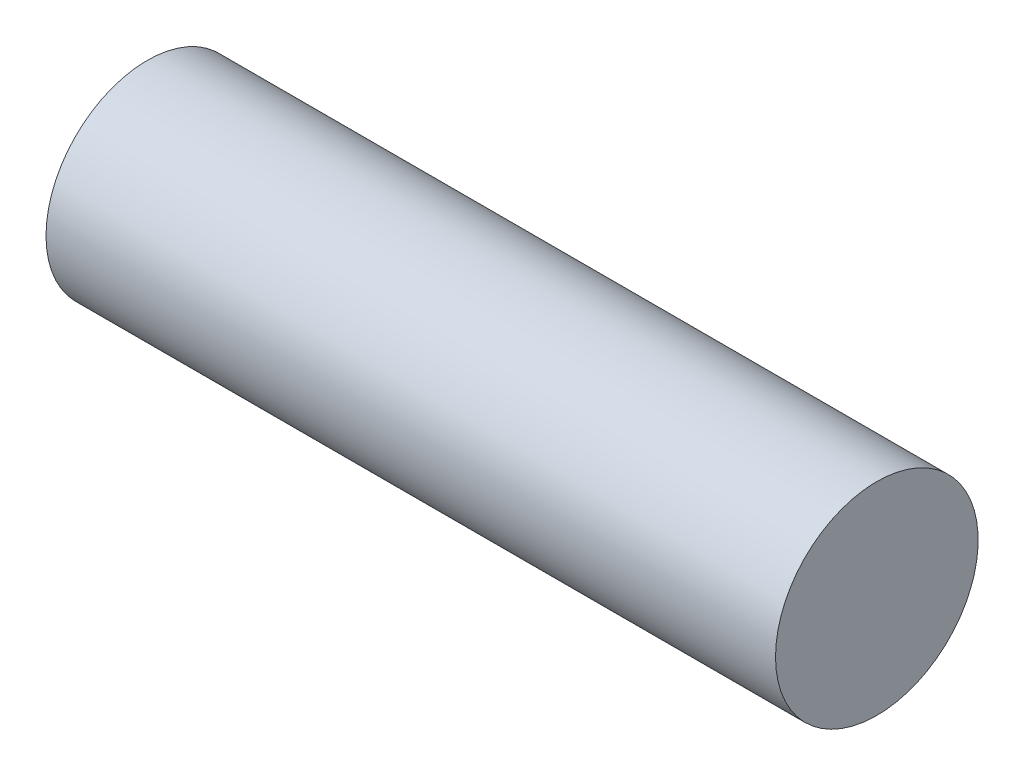
ISO-10303-21;
HEADER;
FILE_DESCRIPTION(('STEP AP214'),'2;1');
FILE_NAME('part.step','',(''),(''),'','','');
FILE_SCHEMA(('AUTOMOTIVE_DESIGN { 1 0 10303 214 1 1 1 1 }'));
ENDSEC;
DATA;
#1=APPLICATION_CONTEXT('core data for automotive mechanical design processes');
#2=APPLICATION_PROTOCOL_DEFINITION('international standard','automotive_design',2000,#1);
#3=PRODUCT_CONTEXT('',#1,'mechanical');
#4=PRODUCT('Part','Part','',(#3));
#5=PRODUCT_RELATED_PRODUCT_CATEGORY('part','',(#4));
#6=PRODUCT_DEFINITION_FORMATION('','',#4);
#7=PRODUCT_DEFINITION_CONTEXT('part definition',#1,'design');
#8=PRODUCT_DEFINITION('design','',#6,#7);
#9=PRODUCT_DEFINITION_SHAPE('','',#8);
#10=(LENGTH_UNIT() NAMED_UNIT(*) SI_UNIT(.MILLI.,.METRE.));
#11=(NAMED_UNIT(*) PLANE_ANGLE_UNIT() SI_UNIT($,.RADIAN.));
#12=(NAMED_UNIT(*) SI_UNIT($,.STERADIAN.) SOLID_ANGLE_UNIT());
#13=UNCERTAINTY_MEASURE_WITH_UNIT(LENGTH_MEASURE(1.E-05),#10,'distance_accuracy_value','');
#14=(GEOMETRIC_REPRESENTATION_CONTEXT(3) GLOBAL_UNCERTAINTY_ASSIGNED_CONTEXT((#13)) GLOBAL_UNIT_ASSIGNED_CONTEXT((#10,
#11,#12)) REPRESENTATION_CONTEXT('',''));
#15=CARTESIAN_POINT('',(0.,0.,0.));
#16=DIRECTION('',(0.,0.,1.));
#17=DIRECTION('',(1.,0.,0.));
#18=AXIS2_PLACEMENT_3D('',#15,#16,#17);
#19=CARTESIAN_POINT('',(360.,0.,0.));
#20=DIRECTION('',(-1.,0.,0.));
#21=DIRECTION('',(0.,0.,1.));
#22=AXIS2_PLACEMENT_3D('',#19,#20,#21);
#23=CYLINDRICAL_SURFACE('',#22,50.);
#24=CARTESIAN_POINT('',(360.,0.,0.));
#25=DIRECTION('',(1.,0.,0.));
#26=DIRECTION('',(0.,0.,-1.));
#27=AXIS2_PLACEMENT_3D('',#24,#25,#26);
#28=CIRCLE('',#27,50.);
#29=CARTESIAN_POINT('',(360.,0.,50.));
#30=VERTEX_POINT('',#29);
#31=EDGE_CURVE('E10',#30,#30,#28,.T.);
#32=CARTESIAN_POINT('',(0.,0.,0.));
#33=DIRECTION('',(1.,0.,0.));
#34=DIRECTION('',(0.,0.,-1.));
#35=AXIS2_PLACEMENT_3D('',#32,#33,#34);
#36=CIRCLE('',#35,50.);
#37=CARTESIAN_POINT('',(0.,0.,50.));
#38=VERTEX_POINT('',#37);
#39=EDGE_CURVE('E40',#38,#38,#36,.T.);
#40=CARTESIAN_POINT('',(360.,0.,50.));
#41=CARTESIAN_POINT('',(356.25,0.,50.));
#42=CARTESIAN_POINT('',(352.5,0.,50.));
#43=CARTESIAN_POINT('',(345.,0.,50.));
#44=CARTESIAN_POINT('',(341.25,0.,50.));
#45=CARTESIAN_POINT('',(333.75,0.,50.));
#46=CARTESIAN_POINT('',(330.,0.,50.));
#47=CARTESIAN_POINT('',(322.5,0.,50.));
#48=CARTESIAN_POINT('',(318.75,0.,50.));
#49=CARTESIAN_POINT('',(311.25,0.,50.));
#50=CARTESIAN_POINT('',(307.5,0.,50.));
#51=CARTESIAN_POINT('',(300.,0.,50.));
#52=CARTESIAN_POINT('',(296.25,0.,50.));
#53=CARTESIAN_POINT('',(288.75,0.,50.));
#54=CARTESIAN_POINT('',(285.,0.,50.));
#55=CARTESIAN_POINT('',(277.5,0.,50.));
#56=CARTESIAN_POINT('',(273.75,0.,50.));
#57=CARTESIAN_POINT('',(266.25,0.,50.));
#58=CARTESIAN_POINT('',(262.5,0.,50.));
#59=CARTESIAN_POINT('',(255.,0.,50.));
#60=CARTESIAN_POINT('',(251.25,0.,50.));
#61=CARTESIAN_POINT('',(243.75,0.,50.));
#62=CARTESIAN_POINT('',(240.,0.,50.));
#63=CARTESIAN_POINT('',(232.5,0.,50.));
#64=CARTESIAN_POINT('',(228.75,0.,50.));
#65=CARTESIAN_POINT('',(221.25,0.,50.));
#66=CARTESIAN_POINT('',(217.5,0.,50.));
#67=CARTESIAN_POINT('',(210.,0.,50.));
#68=CARTESIAN_POINT('',(206.25,0.,50.));
#69=CARTESIAN_POINT('',(198.75,0.,50.));
#70=CARTESIAN_POINT('',(195.,0.,50.));
#71=CARTESIAN_POINT('',(187.5,0.,50.));
#72=CARTESIAN_POINT('',(183.75,0.,50.));
#73=CARTESIAN_POINT('',(176.25,0.,50.));
#74=CARTESIAN_POINT('',(172.5,0.,50.));
#75=CARTESIAN_POINT('',(165.,0.,50.));
#76=CARTESIAN_POINT('',(161.25,0.,50.));
#77=CARTESIAN_POINT('',(153.75,0.,50.));
#78=CARTESIAN_POINT('',(150.,0.,50.));
#79=CARTESIAN_POINT('',(142.5,0.,50.));
#80=CARTESIAN_POINT('',(138.75,0.,50.));
#81=CARTESIAN_POINT('',(131.25,0.,50.));
#82=CARTESIAN_POINT('',(127.5,0.,50.));
#83=CARTESIAN_POINT('',(120.,0.,50.));
#84=CARTESIAN_POINT('',(116.25,0.,50.));
#85=CARTESIAN_POINT('',(108.75,0.,50.));
#86=CARTESIAN_POINT('',(105.,0.,50.));
#87=CARTESIAN_POINT('',(97.5,0.,50.));
#88=CARTESIAN_POINT('',(93.75,0.,50.));
#89=CARTESIAN_POINT('',(86.25,0.,50.));
#90=CARTESIAN_POINT('',(82.5,0.,50.));
#91=CARTESIAN_POINT('',(75.,0.,50.));
#92=CARTESIAN_POINT('',(71.25,0.,50.));
#93=CARTESIAN_POINT('',(63.75,0.,50.));
#94=CARTESIAN_POINT('',(60.,0.,50.));
#95=CARTESIAN_POINT('',(52.5,0.,50.));
#96=CARTESIAN_POINT('',(48.75,0.,50.));
#97=CARTESIAN_POINT('',(41.25,0.,50.));
#98=CARTESIAN_POINT('',(37.5,0.,50.));
#99=CARTESIAN_POINT('',(30.,0.,50.));
#100=CARTESIAN_POINT('',(26.25,0.,50.));
#101=CARTESIAN_POINT('',(18.75,0.,50.));
#102=CARTESIAN_POINT('',(14.9999999999999,0.,50.));
#103=CARTESIAN_POINT('',(7.49999999999993,0.,50.));
#104=CARTESIAN_POINT('',(3.74999999999994,0.,50.));
#105=CARTESIAN_POINT('',(0.,0.,50.));
#106=B_SPLINE_CURVE_WITH_KNOTS('',3,(#40,#41,#42,#43,#44,#45,#46,#47,#48,#49,#50,#51,#52,#53,
#54,#55,#56,#57,#58,#59,#60,#61,#62,#63,#64,#65,#66,#67,#68,#69,#70,#71,#72,#73,#74,#75,#76,#77,
#78,#79,#80,#81,#82,#83,#84,#85,#86,#87,#88,#89,#90,#91,#92,#93,#94,#95,#96,#97,#98,#99,#100,
#101,#102,#103,#104,#105),.UNSPECIFIED.,.F.,.F.,(4,2,2,2,2,2,2,2,2,2,2,2,2,2,2,2,2,2,2,2,2,2,2,
2,2,2,2,2,2,2,2,2,4),(0.,11.25,22.5,33.7500000000001,45.,56.25,67.5,78.75,90.,101.25,112.5,
123.75,135.,146.25,157.5,168.75,180.,191.25,202.5,213.75,225.,236.25,247.5,258.75,270.,281.25,
292.5,303.75,315.,326.25,337.5,348.75,360.),.UNSPECIFIED.);
#107=EDGE_CURVE('BSEAM37',#30,#38,#106,.T.);
#108=ORIENTED_EDGE('',*,*,#31,.F.);
#109=ORIENTED_EDGE('',*,*,#39,.T.);
#110=ORIENTED_EDGE('',*,*,#107,.T.);
#111=ORIENTED_EDGE('',*,*,#107,.F.);
#112=EDGE_LOOP('',(#108,#110,#109,#111));
#113=FACE_BOUND('',#112,.T.);
#114=ADVANCED_FACE('F37',(#113),#23,.T.);
#115=CARTESIAN_POINT('',(360.,0.,0.));
#116=DIRECTION('',(1.,0.,0.));
#117=DIRECTION('',(0.,0.,-1.));
#118=AXIS2_PLACEMENT_3D('',#115,#116,#117);
#119=PLANE('',#118);
#120=ORIENTED_EDGE('',*,*,#31,.T.);
#121=EDGE_LOOP('',(#120));
#122=FACE_BOUND('',#121,.T.);
#123=ADVANCED_FACE('F52',(#122),#119,.T.);
#124=CARTESIAN_POINT('',(0.,0.,0.));
#125=DIRECTION('',(1.,0.,0.));
#126=DIRECTION('',(0.,0.,-1.));
#127=AXIS2_PLACEMENT_3D('',#124,#125,#126);
#128=PLANE('',#127);
#129=ORIENTED_EDGE('',*,*,#39,.F.);
#130=EDGE_LOOP('',(#129));
#131=FACE_BOUND('',#130,.T.);
#132=ADVANCED_FACE('F50',(#131),#128,.F.);
#133=CLOSED_SHELL('',(#114,#123,#132));
#134=MANIFOLD_SOLID_BREP('B2',#133);
#135=ADVANCED_BREP_SHAPE_REPRESENTATION('',(#18,#134),#14);
#136=SHAPE_DEFINITION_REPRESENTATION(#9,#135);
ENDSEC;
END-ISO-10303-21;
